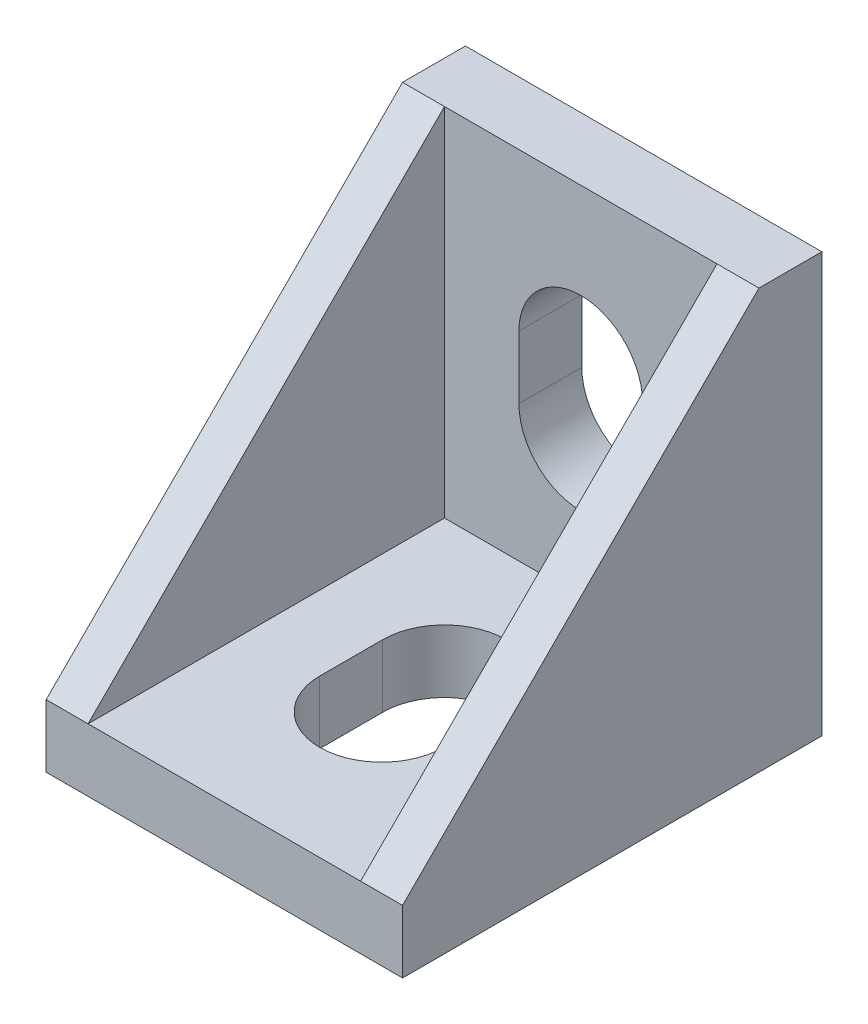
ISO-10303-21;
HEADER;
FILE_DESCRIPTION(('STEP AP214'),'2;1');
FILE_NAME('part.step','',(''),(''),'','','');
FILE_SCHEMA(('AUTOMOTIVE_DESIGN { 1 0 10303 214 1 1 1 1 }'));
ENDSEC;
DATA;
#1=APPLICATION_CONTEXT('core data for automotive mechanical design processes');
#2=APPLICATION_PROTOCOL_DEFINITION('international standard','automotive_design',2000,#1);
#3=PRODUCT_CONTEXT('',#1,'mechanical');
#4=PRODUCT('Part','Part','',(#3));
#5=PRODUCT_RELATED_PRODUCT_CATEGORY('part','',(#4));
#6=PRODUCT_DEFINITION_FORMATION('','',#4);
#7=PRODUCT_DEFINITION_CONTEXT('part definition',#1,'design');
#8=PRODUCT_DEFINITION('design','',#6,#7);
#9=PRODUCT_DEFINITION_SHAPE('','',#8);
#10=(LENGTH_UNIT() NAMED_UNIT(*) SI_UNIT(.MILLI.,.METRE.));
#11=(NAMED_UNIT(*) PLANE_ANGLE_UNIT() SI_UNIT($,.RADIAN.));
#12=(NAMED_UNIT(*) SI_UNIT($,.STERADIAN.) SOLID_ANGLE_UNIT());
#13=UNCERTAINTY_MEASURE_WITH_UNIT(LENGTH_MEASURE(1.E-05),#10,'distance_accuracy_value','');
#14=(GEOMETRIC_REPRESENTATION_CONTEXT(3) GLOBAL_UNCERTAINTY_ASSIGNED_CONTEXT((#13)) GLOBAL_UNIT_ASSIGNED_CONTEXT((#10,
#11,#12)) REPRESENTATION_CONTEXT('',''));
#15=CARTESIAN_POINT('',(0.,0.,0.));
#16=DIRECTION('',(0.,0.,1.));
#17=DIRECTION('',(1.,0.,0.));
#18=AXIS2_PLACEMENT_3D('',#15,#16,#17);
#19=CARTESIAN_POINT('',(8.5,20.,0.));
#20=DIRECTION('',(0.,0.,1.));
#21=DIRECTION('',(0.,-1.,0.));
#22=AXIS2_PLACEMENT_3D('',#19,#20,#21);
#23=PLANE('',#22);
#24=DIRECTION('',(0.,1.,0.));
#25=VECTOR('',#24,1.);
#26=CARTESIAN_POINT('',(-8.5,20.,0.));
#27=LINE('',#26,#25);
#28=CARTESIAN_POINT('',(-8.5,0.,0.));
#29=VERTEX_POINT('',#28);
#30=CARTESIAN_POINT('',(-8.5,20.,0.));
#31=VERTEX_POINT('',#30);
#32=EDGE_CURVE('E285',#29,#31,#27,.T.);
#33=ORIENTED_EDGE('',*,*,#32,.T.);
#34=DIRECTION('',(-1.,0.,0.));
#35=VECTOR('',#34,1.);
#36=CARTESIAN_POINT('',(8.5,20.,0.));
#37=LINE('',#36,#35);
#38=CARTESIAN_POINT('',(8.5,20.,0.));
#39=VERTEX_POINT('',#38);
#40=EDGE_CURVE('E11',#39,#31,#37,.T.);
#41=ORIENTED_EDGE('',*,*,#40,.F.);
#42=DIRECTION('',(0.,1.,0.));
#43=VECTOR('',#42,1.);
#44=CARTESIAN_POINT('',(8.5,20.,0.));
#45=LINE('',#44,#43);
#46=CARTESIAN_POINT('',(8.5,0.,0.));
#47=VERTEX_POINT('',#46);
#48=EDGE_CURVE('E288',#47,#39,#45,.T.);
#49=ORIENTED_EDGE('',*,*,#48,.F.);
#50=DIRECTION('',(-1.,0.,0.));
#51=VECTOR('',#50,1.);
#52=CARTESIAN_POINT('',(8.5,0.,0.));
#53=LINE('',#52,#51);
#54=EDGE_CURVE('E303',#47,#29,#53,.T.);
#55=ORIENTED_EDGE('',*,*,#54,.T.);
#56=EDGE_LOOP('',(#33,#41,#49,#55));
#57=FACE_BOUND('',#56,.T.);
#58=DIRECTION('',(0.,-1.,0.));
#59=VECTOR('',#58,1.);
#60=CARTESIAN_POINT('',(-2.95,9.5,0.));
#61=LINE('',#60,#59);
#62=CARTESIAN_POINT('',(-2.95,12.5,0.));
#63=VERTEX_POINT('',#62);
#64=CARTESIAN_POINT('',(-2.95,9.5,0.));
#65=VERTEX_POINT('',#64);
#66=EDGE_CURVE('E219',#63,#65,#61,.T.);
#67=ORIENTED_EDGE('',*,*,#66,.T.);
#68=CARTESIAN_POINT('',(0.,9.5,0.));
#69=DIRECTION('',(0.,0.,1.));
#70=DIRECTION('',(1.,0.,0.));
#71=AXIS2_PLACEMENT_3D('',#68,#69,#70);
#72=CIRCLE('',#71,2.95);
#73=CARTESIAN_POINT('',(2.95,9.5,0.));
#74=VERTEX_POINT('',#73);
#75=EDGE_CURVE('E206',#65,#74,#72,.T.);
#76=ORIENTED_EDGE('',*,*,#75,.T.);
#77=DIRECTION('',(0.,1.,0.));
#78=VECTOR('',#77,1.);
#79=CARTESIAN_POINT('',(2.95,9.5,0.));
#80=LINE('',#79,#78);
#81=CARTESIAN_POINT('',(2.95,12.5,0.));
#82=VERTEX_POINT('',#81);
#83=EDGE_CURVE('E210',#74,#82,#80,.T.);
#84=ORIENTED_EDGE('',*,*,#83,.T.);
#85=CARTESIAN_POINT('',(0.,12.5,0.));
#86=DIRECTION('',(0.,0.,1.));
#87=DIRECTION('',(1.,0.,0.));
#88=AXIS2_PLACEMENT_3D('',#85,#86,#87);
#89=CIRCLE('',#88,2.95);
#90=EDGE_CURVE('E215',#82,#63,#89,.T.);
#91=ORIENTED_EDGE('',*,*,#90,.T.);
#92=EDGE_LOOP('',(#67,#76,#84,#91));
#93=FACE_BOUND('',#92,.T.);
#94=ADVANCED_FACE('F44',(#57,#93),#23,.F.);
#95=CARTESIAN_POINT('',(8.5,0.,0.));
#96=DIRECTION('',(0.,1.,0.));
#97=DIRECTION('',(0.,0.,1.));
#98=AXIS2_PLACEMENT_3D('',#95,#96,#97);
#99=PLANE('',#98);
#100=DIRECTION('',(0.,0.,-1.));
#101=VECTOR('',#100,1.);
#102=CARTESIAN_POINT('',(2.95,0.,9.5));
#103=LINE('',#102,#101);
#104=CARTESIAN_POINT('',(2.95,0.,12.5));
#105=VERTEX_POINT('',#104);
#106=CARTESIAN_POINT('',(2.95,0.,9.5));
#107=VERTEX_POINT('',#106);
#108=EDGE_CURVE('E166',#105,#107,#103,.T.);
#109=ORIENTED_EDGE('',*,*,#108,.T.);
#110=CARTESIAN_POINT('',(0.,0.,9.5));
#111=DIRECTION('',(0.,1.,0.));
#112=DIRECTION('',(0.,0.,1.));
#113=AXIS2_PLACEMENT_3D('',#110,#111,#112);
#114=CIRCLE('',#113,2.95);
#115=CARTESIAN_POINT('',(-2.95,0.,9.5));
#116=VERTEX_POINT('',#115);
#117=EDGE_CURVE('E159',#107,#116,#114,.T.);
#118=ORIENTED_EDGE('',*,*,#117,.T.);
#119=DIRECTION('',(0.,0.,1.));
#120=VECTOR('',#119,1.);
#121=CARTESIAN_POINT('',(-2.95,0.,9.5));
#122=LINE('',#121,#120);
#123=CARTESIAN_POINT('',(-2.95,0.,12.5));
#124=VERTEX_POINT('',#123);
#125=EDGE_CURVE('E169',#116,#124,#122,.T.);
#126=ORIENTED_EDGE('',*,*,#125,.T.);
#127=CARTESIAN_POINT('',(0.,0.,12.5));
#128=DIRECTION('',(0.,1.,0.));
#129=DIRECTION('',(0.,0.,1.));
#130=AXIS2_PLACEMENT_3D('',#127,#128,#129);
#131=CIRCLE('',#130,2.95);
#132=EDGE_CURVE('E67',#124,#105,#131,.T.);
#133=ORIENTED_EDGE('',*,*,#132,.T.);
#134=EDGE_LOOP('',(#109,#118,#126,#133));
#135=FACE_BOUND('',#134,.T.);
#136=DIRECTION('',(0.,0.,-1.));
#137=VECTOR('',#136,1.);
#138=CARTESIAN_POINT('',(-8.5,0.,0.));
#139=LINE('',#138,#137);
#140=CARTESIAN_POINT('',(-8.5,0.,20.));
#141=VERTEX_POINT('',#140);
#142=EDGE_CURVE('E293',#141,#29,#139,.T.);
#143=ORIENTED_EDGE('',*,*,#142,.T.);
#144=ORIENTED_EDGE('',*,*,#54,.F.);
#145=DIRECTION('',(0.,0.,-1.));
#146=VECTOR('',#145,1.);
#147=CARTESIAN_POINT('',(8.5,0.,0.));
#148=LINE('',#147,#146);
#149=CARTESIAN_POINT('',(8.5,0.,20.));
#150=VERTEX_POINT('',#149);
#151=EDGE_CURVE('E300',#150,#47,#148,.T.);
#152=ORIENTED_EDGE('',*,*,#151,.F.);
#153=DIRECTION('',(-1.,0.,0.));
#154=VECTOR('',#153,1.);
#155=CARTESIAN_POINT('',(8.5,0.,20.));
#156=LINE('',#155,#154);
#157=EDGE_CURVE('E318',#150,#141,#156,.T.);
#158=ORIENTED_EDGE('',*,*,#157,.T.);
#159=EDGE_LOOP('',(#143,#144,#152,#158));
#160=FACE_BOUND('',#159,.T.);
#161=ADVANCED_FACE('F174',(#135,#160),#99,.F.);
#162=CARTESIAN_POINT('',(8.5,3.,3.));
#163=DIRECTION('',(0.,0.,-1.));
#164=DIRECTION('',(0.,1.,0.));
#165=AXIS2_PLACEMENT_3D('',#162,#163,#164);
#166=PLANE('',#165);
#167=DIRECTION('',(0.,1.,0.));
#168=VECTOR('',#167,1.);
#169=CARTESIAN_POINT('',(2.95,9.5,3.));
#170=LINE('',#169,#168);
#171=CARTESIAN_POINT('',(2.95,9.5,3.));
#172=VERTEX_POINT('',#171);
#173=CARTESIAN_POINT('',(2.95,12.5,3.));
#174=VERTEX_POINT('',#173);
#175=EDGE_CURVE('E226',#172,#174,#170,.T.);
#176=ORIENTED_EDGE('',*,*,#175,.F.);
#177=CARTESIAN_POINT('',(0.,9.5,3.));
#178=DIRECTION('',(0.,0.,1.));
#179=DIRECTION('',(1.,0.,0.));
#180=AXIS2_PLACEMENT_3D('',#177,#178,#179);
#181=CIRCLE('',#180,2.95);
#182=CARTESIAN_POINT('',(-2.95,9.5,3.));
#183=VERTEX_POINT('',#182);
#184=EDGE_CURVE('E200',#183,#172,#181,.T.);
#185=ORIENTED_EDGE('',*,*,#184,.F.);
#186=DIRECTION('',(0.,-1.,0.));
#187=VECTOR('',#186,1.);
#188=CARTESIAN_POINT('',(-2.95,9.5,3.));
#189=LINE('',#188,#187);
#190=CARTESIAN_POINT('',(-2.95,12.5,3.));
#191=VERTEX_POINT('',#190);
#192=EDGE_CURVE('E211',#191,#183,#189,.T.);
#193=ORIENTED_EDGE('',*,*,#192,.F.);
#194=CARTESIAN_POINT('',(0.,12.5,3.));
#195=DIRECTION('',(0.,0.,1.));
#196=DIRECTION('',(1.,0.,0.));
#197=AXIS2_PLACEMENT_3D('',#194,#195,#196);
#198=CIRCLE('',#197,2.95);
#199=EDGE_CURVE('E230',#174,#191,#198,.T.);
#200=ORIENTED_EDGE('',*,*,#199,.F.);
#201=EDGE_LOOP('',(#176,#185,#193,#200));
#202=FACE_BOUND('',#201,.T.);
#203=DIRECTION('',(0.,1.,0.));
#204=VECTOR('',#203,1.);
#205=CARTESIAN_POINT('',(-6.5,3.,3.));
#206=LINE('',#205,#204);
#207=CARTESIAN_POINT('',(-6.5,3.,3.));
#208=VERTEX_POINT('',#207);
#209=CARTESIAN_POINT('',(-6.5,20.,3.));
#210=VERTEX_POINT('',#209);
#211=EDGE_CURVE('E254',#208,#210,#206,.T.);
#212=ORIENTED_EDGE('',*,*,#211,.F.);
#213=DIRECTION('',(-1.,0.,0.));
#214=VECTOR('',#213,1.);
#215=CARTESIAN_POINT('',(8.5,3.,3.));
#216=LINE('',#215,#214);
#217=CARTESIAN_POINT('',(6.5,3.,3.));
#218=VERTEX_POINT('',#217);
#219=EDGE_CURVE('E327',#218,#208,#216,.T.);
#220=ORIENTED_EDGE('',*,*,#219,.F.);
#221=DIRECTION('',(0.,1.,0.));
#222=VECTOR('',#221,1.);
#223=CARTESIAN_POINT('',(6.5,3.,3.));
#224=LINE('',#223,#222);
#225=CARTESIAN_POINT('',(6.5,20.,3.));
#226=VERTEX_POINT('',#225);
#227=EDGE_CURVE('E281',#218,#226,#224,.T.);
#228=ORIENTED_EDGE('',*,*,#227,.T.);
#229=DIRECTION('',(-1.,0.,0.));
#230=VECTOR('',#229,1.);
#231=CARTESIAN_POINT('',(8.5,20.,3.));
#232=LINE('',#231,#230);
#233=EDGE_CURVE('E330',#226,#210,#232,.T.);
#234=ORIENTED_EDGE('',*,*,#233,.T.);
#235=EDGE_LOOP('',(#212,#220,#228,#234));
#236=FACE_BOUND('',#235,.T.);
#237=ADVANCED_FACE('F339',(#202,#236),#166,.F.);
#238=CARTESIAN_POINT('',(8.5,3.,20.));
#239=DIRECTION('',(0.,-1.,0.));
#240=DIRECTION('',(0.,0.,-1.));
#241=AXIS2_PLACEMENT_3D('',#238,#239,#240);
#242=PLANE('',#241);
#243=DIRECTION('',(0.,0.,1.));
#244=VECTOR('',#243,1.);
#245=CARTESIAN_POINT('',(-2.95,3.,9.5));
#246=LINE('',#245,#244);
#247=CARTESIAN_POINT('',(-2.95,3.,9.5));
#248=VERTEX_POINT('',#247);
#249=CARTESIAN_POINT('',(-2.95,3.,12.5));
#250=VERTEX_POINT('',#249);
#251=EDGE_CURVE('E191',#248,#250,#246,.T.);
#252=ORIENTED_EDGE('',*,*,#251,.F.);
#253=CARTESIAN_POINT('',(0.,3.,9.5));
#254=DIRECTION('',(0.,1.,0.));
#255=DIRECTION('',(0.,0.,1.));
#256=AXIS2_PLACEMENT_3D('',#253,#254,#255);
#257=CIRCLE('',#256,2.95);
#258=CARTESIAN_POINT('',(2.95,3.,9.5));
#259=VERTEX_POINT('',#258);
#260=EDGE_CURVE('E59',#259,#248,#257,.T.);
#261=ORIENTED_EDGE('',*,*,#260,.F.);
#262=DIRECTION('',(0.,0.,-1.));
#263=VECTOR('',#262,1.);
#264=CARTESIAN_POINT('',(2.95,3.,9.5));
#265=LINE('',#264,#263);
#266=CARTESIAN_POINT('',(2.95,3.,12.5));
#267=VERTEX_POINT('',#266);
#268=EDGE_CURVE('E178',#267,#259,#265,.T.);
#269=ORIENTED_EDGE('',*,*,#268,.F.);
#270=CARTESIAN_POINT('',(0.,3.,12.5));
#271=DIRECTION('',(0.,1.,0.));
#272=DIRECTION('',(0.,0.,1.));
#273=AXIS2_PLACEMENT_3D('',#270,#271,#272);
#274=CIRCLE('',#273,2.95);
#275=EDGE_CURVE('E182',#250,#267,#274,.T.);
#276=ORIENTED_EDGE('',*,*,#275,.F.);
#277=EDGE_LOOP('',(#252,#261,#269,#276));
#278=FACE_BOUND('',#277,.T.);
#279=DIRECTION('',(0.,0.,-1.));
#280=VECTOR('',#279,1.);
#281=CARTESIAN_POINT('',(-6.5,3.,20.));
#282=LINE('',#281,#280);
#283=CARTESIAN_POINT('',(-6.5,3.,20.));
#284=VERTEX_POINT('',#283);
#285=EDGE_CURVE('E258',#284,#208,#282,.T.);
#286=ORIENTED_EDGE('',*,*,#285,.F.);
#287=DIRECTION('',(-1.,0.,0.));
#288=VECTOR('',#287,1.);
#289=CARTESIAN_POINT('',(8.5,3.,20.));
#290=LINE('',#289,#288);
#291=CARTESIAN_POINT('',(6.5,3.,20.));
#292=VERTEX_POINT('',#291);
#293=EDGE_CURVE('E322',#292,#284,#290,.T.);
#294=ORIENTED_EDGE('',*,*,#293,.F.);
#295=DIRECTION('',(0.,0.,-1.));
#296=VECTOR('',#295,1.);
#297=CARTESIAN_POINT('',(6.5,3.,20.));
#298=LINE('',#297,#296);
#299=EDGE_CURVE('E277',#292,#218,#298,.T.);
#300=ORIENTED_EDGE('',*,*,#299,.T.);
#301=ORIENTED_EDGE('',*,*,#219,.T.);
#302=EDGE_LOOP('',(#286,#294,#300,#301));
#303=FACE_BOUND('',#302,.T.);
#304=ADVANCED_FACE('F372',(#278,#303),#242,.F.);
#305=CARTESIAN_POINT('',(8.5,20.,3.));
#306=DIRECTION('',(0.,-1.,0.));
#307=DIRECTION('',(0.,0.,-1.));
#308=AXIS2_PLACEMENT_3D('',#305,#306,#307);
#309=PLANE('',#308);
#310=DIRECTION('',(0.,0.,1.));
#311=VECTOR('',#310,1.);
#312=CARTESIAN_POINT('',(-8.5,20.,3.));
#313=LINE('',#312,#311);
#314=CARTESIAN_POINT('',(-8.5,20.,3.));
#315=VERTEX_POINT('',#314);
#316=EDGE_CURVE('E307',#31,#315,#313,.T.);
#317=ORIENTED_EDGE('',*,*,#316,.T.);
#318=DIRECTION('',(-1.,0.,0.));
#319=VECTOR('',#318,1.);
#320=CARTESIAN_POINT('',(-6.5,20.,3.));
#321=LINE('',#320,#319);
#322=EDGE_CURVE('E262',#210,#315,#321,.T.);
#323=ORIENTED_EDGE('',*,*,#322,.F.);
#324=ORIENTED_EDGE('',*,*,#233,.F.);
#325=CARTESIAN_POINT('',(8.5,20.,3.));
#326=VERTEX_POINT('',#325);
#327=EDGE_CURVE('E52',#326,#226,#232,.T.);
#328=ORIENTED_EDGE('',*,*,#327,.F.);
#329=DIRECTION('',(0.,0.,1.));
#330=VECTOR('',#329,1.);
#331=CARTESIAN_POINT('',(8.5,20.,3.));
#332=LINE('',#331,#330);
#333=EDGE_CURVE('E292',#39,#326,#332,.T.);
#334=ORIENTED_EDGE('',*,*,#333,.F.);
#335=ORIENTED_EDGE('',*,*,#40,.T.);
#336=EDGE_LOOP('',(#317,#323,#324,#328,#334,#335));
#337=FACE_BOUND('',#336,.T.);
#338=ADVANCED_FACE('F398',(#337),#309,.F.);
#339=CARTESIAN_POINT('',(8.5,0.,20.));
#340=DIRECTION('',(0.,0.,-1.));
#341=DIRECTION('',(-1.,0.,0.));
#342=AXIS2_PLACEMENT_3D('',#339,#340,#341);
#343=PLANE('',#342);
#344=DIRECTION('',(0.,-1.,0.));
#345=VECTOR('',#344,1.);
#346=CARTESIAN_POINT('',(-8.5,0.,20.));
#347=LINE('',#346,#345);
#348=CARTESIAN_POINT('',(-8.5,3.,20.));
#349=VERTEX_POINT('',#348);
#350=EDGE_CURVE('E310',#349,#141,#347,.T.);
#351=ORIENTED_EDGE('',*,*,#350,.T.);
#352=ORIENTED_EDGE('',*,*,#157,.F.);
#353=DIRECTION('',(0.,-1.,0.));
#354=VECTOR('',#353,1.);
#355=CARTESIAN_POINT('',(8.5,0.,20.));
#356=LINE('',#355,#354);
#357=CARTESIAN_POINT('',(8.5,3.,20.));
#358=VERTEX_POINT('',#357);
#359=EDGE_CURVE('E297',#358,#150,#356,.T.);
#360=ORIENTED_EDGE('',*,*,#359,.F.);
#361=EDGE_CURVE('E323',#358,#292,#290,.T.);
#362=ORIENTED_EDGE('',*,*,#361,.T.);
#363=ORIENTED_EDGE('',*,*,#293,.T.);
#364=DIRECTION('',(-1.,0.,0.));
#365=VECTOR('',#364,1.);
#366=CARTESIAN_POINT('',(-6.5,3.,20.));
#367=LINE('',#366,#365);
#368=EDGE_CURVE('E266',#284,#349,#367,.T.);
#369=ORIENTED_EDGE('',*,*,#368,.T.);
#370=EDGE_LOOP('',(#351,#352,#360,#362,#363,#369));
#371=FACE_BOUND('',#370,.T.);
#372=ADVANCED_FACE('F352',(#371),#343,.F.);
#373=CARTESIAN_POINT('',(8.5,0.,0.));
#374=DIRECTION('',(-1.,0.,0.));
#375=DIRECTION('',(0.,0.,1.));
#376=AXIS2_PLACEMENT_3D('',#373,#374,#375);
#377=PLANE('',#376);
#378=ORIENTED_EDGE('',*,*,#48,.T.);
#379=ORIENTED_EDGE('',*,*,#333,.T.);
#380=DIRECTION('',(0.,-0.707106781186548,0.707106781186548));
#381=VECTOR('',#380,1.);
#382=CARTESIAN_POINT('',(8.5,3.,20.));
#383=LINE('',#382,#381);
#384=EDGE_CURVE('E269',#326,#358,#383,.T.);
#385=ORIENTED_EDGE('',*,*,#384,.T.);
#386=ORIENTED_EDGE('',*,*,#359,.T.);
#387=ORIENTED_EDGE('',*,*,#151,.T.);
#388=EDGE_LOOP('',(#378,#379,#385,#386,#387));
#389=FACE_BOUND('',#388,.T.);
#390=ADVANCED_FACE('F366',(#389),#377,.F.);
#391=CARTESIAN_POINT('',(-8.5,0.,0.));
#392=DIRECTION('',(-1.,0.,0.));
#393=DIRECTION('',(0.,0.,1.));
#394=AXIS2_PLACEMENT_3D('',#391,#392,#393);
#395=PLANE('',#394);
#396=ORIENTED_EDGE('',*,*,#350,.F.);
#397=DIRECTION('',(0.,-0.707106781186548,0.707106781186548));
#398=VECTOR('',#397,1.);
#399=CARTESIAN_POINT('',(-8.5,3.,20.));
#400=LINE('',#399,#398);
#401=EDGE_CURVE('E240',#315,#349,#400,.T.);
#402=ORIENTED_EDGE('',*,*,#401,.F.);
#403=ORIENTED_EDGE('',*,*,#316,.F.);
#404=ORIENTED_EDGE('',*,*,#32,.F.);
#405=ORIENTED_EDGE('',*,*,#142,.F.);
#406=EDGE_LOOP('',(#396,#402,#403,#404,#405));
#407=FACE_BOUND('',#406,.T.);
#408=ADVANCED_FACE('F357',(#407),#395,.T.);
#409=CARTESIAN_POINT('',(6.5,3.,20.));
#410=DIRECTION('',(0.,0.707106781186548,0.707106781186548));
#411=DIRECTION('',(0.,-0.707106781186548,0.707106781186548));
#412=AXIS2_PLACEMENT_3D('',#409,#410,#411);
#413=PLANE('',#412);
#414=ORIENTED_EDGE('',*,*,#384,.F.);
#415=ORIENTED_EDGE('',*,*,#327,.T.);
#416=DIRECTION('',(0.,-0.707106781186548,0.707106781186548));
#417=VECTOR('',#416,1.);
#418=CARTESIAN_POINT('',(6.5,3.,20.));
#419=LINE('',#418,#417);
#420=EDGE_CURVE('E273',#226,#292,#419,.T.);
#421=ORIENTED_EDGE('',*,*,#420,.T.);
#422=ORIENTED_EDGE('',*,*,#361,.F.);
#423=EDGE_LOOP('',(#414,#415,#421,#422));
#424=FACE_BOUND('',#423,.T.);
#425=ADVANCED_FACE('F369',(#424),#413,.T.);
#426=CARTESIAN_POINT('',(6.5,0.,0.));
#427=DIRECTION('',(1.,0.,0.));
#428=DIRECTION('',(0.,0.,-1.));
#429=AXIS2_PLACEMENT_3D('',#426,#427,#428);
#430=PLANE('',#429);
#431=ORIENTED_EDGE('',*,*,#420,.F.);
#432=ORIENTED_EDGE('',*,*,#227,.F.);
#433=ORIENTED_EDGE('',*,*,#299,.F.);
#434=EDGE_LOOP('',(#431,#432,#433));
#435=FACE_BOUND('',#434,.T.);
#436=ADVANCED_FACE('F374',(#435),#430,.F.);
#437=CARTESIAN_POINT('',(-6.5,3.,20.));
#438=DIRECTION('',(0.,-0.707106781186548,-0.707106781186548));
#439=DIRECTION('',(0.,0.707106781186548,-0.707106781186548));
#440=AXIS2_PLACEMENT_3D('',#437,#438,#439);
#441=PLANE('',#440);
#442=ORIENTED_EDGE('',*,*,#401,.T.);
#443=ORIENTED_EDGE('',*,*,#368,.F.);
#444=DIRECTION('',(0.,-0.707106781186548,0.707106781186548));
#445=VECTOR('',#444,1.);
#446=CARTESIAN_POINT('',(-6.5,3.,20.));
#447=LINE('',#446,#445);
#448=EDGE_CURVE('E250',#210,#284,#447,.T.);
#449=ORIENTED_EDGE('',*,*,#448,.F.);
#450=ORIENTED_EDGE('',*,*,#322,.T.);
#451=EDGE_LOOP('',(#442,#443,#449,#450));
#452=FACE_BOUND('',#451,.T.);
#453=ADVANCED_FACE('F347',(#452),#441,.F.);
#454=CARTESIAN_POINT('',(-6.5,0.,0.));
#455=DIRECTION('',(-1.,0.,0.));
#456=DIRECTION('',(0.,0.,-1.));
#457=AXIS2_PLACEMENT_3D('',#454,#455,#456);
#458=PLANE('',#457);
#459=ORIENTED_EDGE('',*,*,#448,.T.);
#460=ORIENTED_EDGE('',*,*,#285,.T.);
#461=ORIENTED_EDGE('',*,*,#211,.T.);
#462=EDGE_LOOP('',(#459,#460,#461));
#463=FACE_BOUND('',#462,.T.);
#464=ADVANCED_FACE('F344',(#463),#458,.F.);
#465=CARTESIAN_POINT('',(0.,9.5,0.));
#466=DIRECTION('',(0.,0.,1.));
#467=DIRECTION('',(1.,0.,0.));
#468=AXIS2_PLACEMENT_3D('',#465,#466,#467);
#469=CYLINDRICAL_SURFACE('',#468,2.95);
#470=ORIENTED_EDGE('',*,*,#184,.T.);
#471=DIRECTION('',(0.,0.,1.));
#472=VECTOR('',#471,1.);
#473=CARTESIAN_POINT('',(2.95,9.5,0.));
#474=LINE('',#473,#472);
#475=EDGE_CURVE('E223',#74,#172,#474,.T.);
#476=ORIENTED_EDGE('',*,*,#475,.F.);
#477=ORIENTED_EDGE('',*,*,#75,.F.);
#478=DIRECTION('',(0.,0.,1.));
#479=VECTOR('',#478,1.);
#480=CARTESIAN_POINT('',(-2.95,9.5,0.));
#481=LINE('',#480,#479);
#482=EDGE_CURVE('E237',#65,#183,#481,.T.);
#483=ORIENTED_EDGE('',*,*,#482,.T.);
#484=EDGE_LOOP('',(#470,#476,#477,#483));
#485=FACE_BOUND('',#484,.T.);
#486=ADVANCED_FACE('F444',(#485),#469,.F.);
#487=CARTESIAN_POINT('',(-2.95,9.5,0.));
#488=DIRECTION('',(-1.,0.,0.));
#489=DIRECTION('',(0.,-1.,0.));
#490=AXIS2_PLACEMENT_3D('',#487,#488,#489);
#491=PLANE('',#490);
#492=ORIENTED_EDGE('',*,*,#192,.T.);
#493=ORIENTED_EDGE('',*,*,#482,.F.);
#494=ORIENTED_EDGE('',*,*,#66,.F.);
#495=DIRECTION('',(0.,0.,1.));
#496=VECTOR('',#495,1.);
#497=CARTESIAN_POINT('',(-2.95,12.5,0.));
#498=LINE('',#497,#496);
#499=EDGE_CURVE('E241',#63,#191,#498,.T.);
#500=ORIENTED_EDGE('',*,*,#499,.T.);
#501=EDGE_LOOP('',(#492,#493,#494,#500));
#502=FACE_BOUND('',#501,.T.);
#503=ADVANCED_FACE('F453',(#502),#491,.F.);
#504=CARTESIAN_POINT('',(0.,12.5,0.));
#505=DIRECTION('',(0.,0.,1.));
#506=DIRECTION('',(1.,0.,0.));
#507=AXIS2_PLACEMENT_3D('',#504,#505,#506);
#508=CYLINDRICAL_SURFACE('',#507,2.95);
#509=ORIENTED_EDGE('',*,*,#199,.T.);
#510=ORIENTED_EDGE('',*,*,#499,.F.);
#511=ORIENTED_EDGE('',*,*,#90,.F.);
#512=DIRECTION('',(0.,0.,1.));
#513=VECTOR('',#512,1.);
#514=CARTESIAN_POINT('',(2.95,12.5,0.));
#515=LINE('',#514,#513);
#516=EDGE_CURVE('E244',#82,#174,#515,.T.);
#517=ORIENTED_EDGE('',*,*,#516,.T.);
#518=EDGE_LOOP('',(#509,#510,#511,#517));
#519=FACE_BOUND('',#518,.T.);
#520=ADVANCED_FACE('F465',(#519),#508,.F.);
#521=CARTESIAN_POINT('',(2.95,9.5,0.));
#522=DIRECTION('',(1.,0.,0.));
#523=DIRECTION('',(0.,1.,0.));
#524=AXIS2_PLACEMENT_3D('',#521,#522,#523);
#525=PLANE('',#524);
#526=ORIENTED_EDGE('',*,*,#175,.T.);
#527=ORIENTED_EDGE('',*,*,#516,.F.);
#528=ORIENTED_EDGE('',*,*,#83,.F.);
#529=ORIENTED_EDGE('',*,*,#475,.T.);
#530=EDGE_LOOP('',(#526,#527,#528,#529));
#531=FACE_BOUND('',#530,.T.);
#532=ADVANCED_FACE('F461',(#531),#525,.F.);
#533=CARTESIAN_POINT('',(0.,0.,9.5));
#534=DIRECTION('',(0.,1.,0.));
#535=DIRECTION('',(0.,0.,1.));
#536=AXIS2_PLACEMENT_3D('',#533,#534,#535);
#537=CYLINDRICAL_SURFACE('',#536,2.95);
#538=ORIENTED_EDGE('',*,*,#260,.T.);
#539=DIRECTION('',(0.,1.,0.));
#540=VECTOR('',#539,1.);
#541=CARTESIAN_POINT('',(-2.95,0.,9.5));
#542=LINE('',#541,#540);
#543=EDGE_CURVE('E155',#116,#248,#542,.T.);
#544=ORIENTED_EDGE('',*,*,#543,.F.);
#545=ORIENTED_EDGE('',*,*,#117,.F.);
#546=DIRECTION('',(0.,1.,0.));
#547=VECTOR('',#546,1.);
#548=CARTESIAN_POINT('',(2.95,0.,9.5));
#549=LINE('',#548,#547);
#550=EDGE_CURVE('E197',#107,#259,#549,.T.);
#551=ORIENTED_EDGE('',*,*,#550,.T.);
#552=EDGE_LOOP('',(#538,#544,#545,#551));
#553=FACE_BOUND('',#552,.T.);
#554=ADVANCED_FACE('F157',(#553),#537,.F.);
#555=CARTESIAN_POINT('',(2.95,0.,9.5));
#556=DIRECTION('',(1.,0.,0.));
#557=DIRECTION('',(0.,0.,-1.));
#558=AXIS2_PLACEMENT_3D('',#555,#556,#557);
#559=PLANE('',#558);
#560=ORIENTED_EDGE('',*,*,#268,.T.);
#561=ORIENTED_EDGE('',*,*,#550,.F.);
#562=ORIENTED_EDGE('',*,*,#108,.F.);
#563=DIRECTION('',(0.,1.,0.));
#564=VECTOR('',#563,1.);
#565=CARTESIAN_POINT('',(2.95,0.,12.5));
#566=LINE('',#565,#564);
#567=EDGE_CURVE('E201',#105,#267,#566,.T.);
#568=ORIENTED_EDGE('',*,*,#567,.T.);
#569=EDGE_LOOP('',(#560,#561,#562,#568));
#570=FACE_BOUND('',#569,.T.);
#571=ADVANCED_FACE('F492',(#570),#559,.F.);
#572=CARTESIAN_POINT('',(0.,0.,12.5));
#573=DIRECTION('',(0.,1.,0.));
#574=DIRECTION('',(0.,0.,1.));
#575=AXIS2_PLACEMENT_3D('',#572,#573,#574);
#576=CYLINDRICAL_SURFACE('',#575,2.95);
#577=ORIENTED_EDGE('',*,*,#275,.T.);
#578=ORIENTED_EDGE('',*,*,#567,.F.);
#579=ORIENTED_EDGE('',*,*,#132,.F.);
#580=DIRECTION('',(0.,1.,0.));
#581=VECTOR('',#580,1.);
#582=CARTESIAN_POINT('',(-2.95,0.,12.5));
#583=LINE('',#582,#581);
#584=EDGE_CURVE('E165',#124,#250,#583,.T.);
#585=ORIENTED_EDGE('',*,*,#584,.T.);
#586=EDGE_LOOP('',(#577,#578,#579,#585));
#587=FACE_BOUND('',#586,.T.);
#588=ADVANCED_FACE('F502',(#587),#576,.F.);
#589=CARTESIAN_POINT('',(-2.95,0.,9.5));
#590=DIRECTION('',(-1.,0.,0.));
#591=DIRECTION('',(0.,0.,1.));
#592=AXIS2_PLACEMENT_3D('',#589,#590,#591);
#593=PLANE('',#592);
#594=ORIENTED_EDGE('',*,*,#251,.T.);
#595=ORIENTED_EDGE('',*,*,#584,.F.);
#596=ORIENTED_EDGE('',*,*,#125,.F.);
#597=ORIENTED_EDGE('',*,*,#543,.T.);
#598=EDGE_LOOP('',(#594,#595,#596,#597));
#599=FACE_BOUND('',#598,.T.);
#600=ADVANCED_FACE('F170',(#599),#593,.F.);
#601=CLOSED_SHELL('',(#94,#161,#237,#304,#338,#372,#390,#408,#425,#436,#453,#464,#486,#503,#520,
#532,#554,#571,#588,#600));
#602=MANIFOLD_SOLID_BREP('B2',#601);
#603=ADVANCED_BREP_SHAPE_REPRESENTATION('',(#18,#602),#14);
#604=SHAPE_DEFINITION_REPRESENTATION(#9,#603);
ENDSEC;
END-ISO-10303-21;
